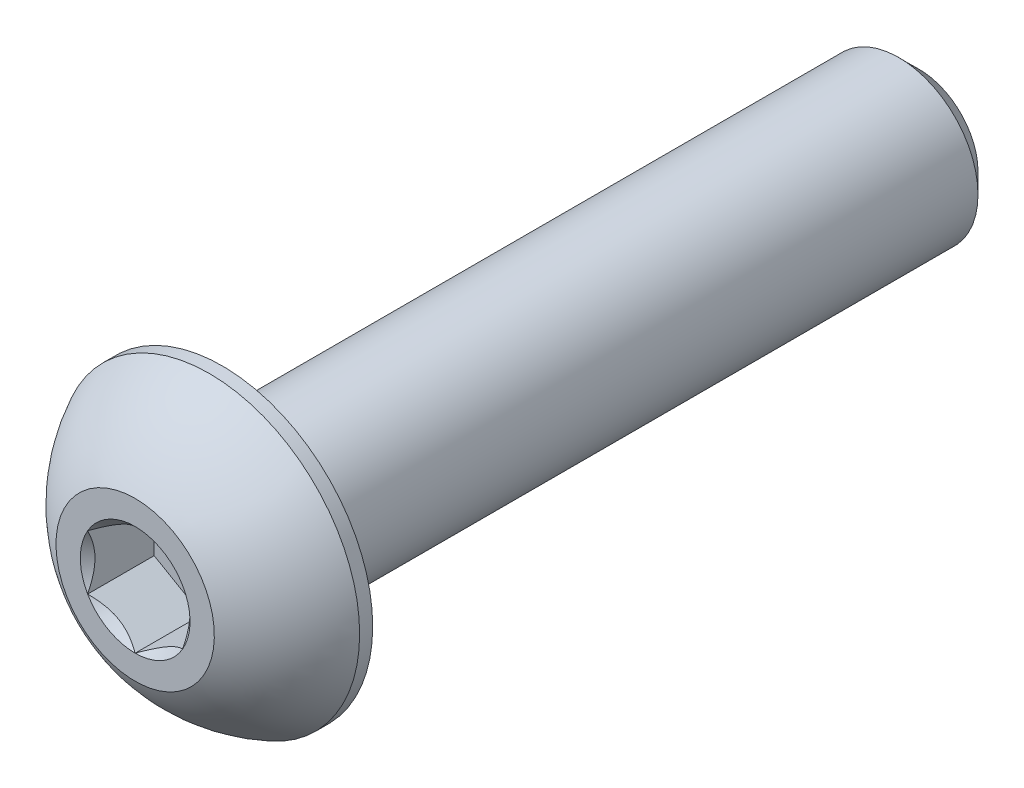
ISO-10303-21;
HEADER;
FILE_DESCRIPTION(('STEP AP214'),'2;1');
FILE_NAME('part.step','',(''),(''),'','','');
FILE_SCHEMA(('AUTOMOTIVE_DESIGN { 1 0 10303 214 1 1 1 1 }'));
ENDSEC;
DATA;
#1=APPLICATION_CONTEXT('core data for automotive mechanical design processes');
#2=APPLICATION_PROTOCOL_DEFINITION('international standard','automotive_design',2000,#1);
#3=PRODUCT_CONTEXT('',#1,'mechanical');
#4=PRODUCT('Part','Part','',(#3));
#5=PRODUCT_RELATED_PRODUCT_CATEGORY('part','',(#4));
#6=PRODUCT_DEFINITION_FORMATION('','',#4);
#7=PRODUCT_DEFINITION_CONTEXT('part definition',#1,'design');
#8=PRODUCT_DEFINITION('design','',#6,#7);
#9=PRODUCT_DEFINITION_SHAPE('','',#8);
#10=(LENGTH_UNIT() NAMED_UNIT(*) SI_UNIT(.MILLI.,.METRE.));
#11=(NAMED_UNIT(*) PLANE_ANGLE_UNIT() SI_UNIT($,.RADIAN.));
#12=(NAMED_UNIT(*) SI_UNIT($,.STERADIAN.) SOLID_ANGLE_UNIT());
#13=UNCERTAINTY_MEASURE_WITH_UNIT(LENGTH_MEASURE(1.E-05),#10,'distance_accuracy_value','');
#14=(GEOMETRIC_REPRESENTATION_CONTEXT(3) GLOBAL_UNCERTAINTY_ASSIGNED_CONTEXT((#13)) GLOBAL_UNIT_ASSIGNED_CONTEXT((#10,
#11,#12)) REPRESENTATION_CONTEXT('',''));
#15=CARTESIAN_POINT('',(0.,0.,0.));
#16=DIRECTION('',(0.,0.,1.));
#17=DIRECTION('',(1.,0.,0.));
#18=AXIS2_PLACEMENT_3D('',#15,#16,#17);
#19=CARTESIAN_POINT('',(0.,0.,12.375));
#20=DIRECTION('',(0.,0.,-1.));
#21=DIRECTION('',(-1.,0.,0.));
#22=AXIS2_PLACEMENT_3D('',#19,#20,#21);
#23=PLANE('',#22);
#24=CARTESIAN_POINT('',(0.,0.,12.375));
#25=DIRECTION('',(0.,0.,1.));
#26=DIRECTION('',(1.,0.,0.));
#27=AXIS2_PLACEMENT_3D('',#24,#25,#26);
#28=CIRCLE('',#27,1.73205080756888);
#29=CARTESIAN_POINT('',(-1.5,0.86602540378444,12.375));
#30=VERTEX_POINT('',#29);
#31=CARTESIAN_POINT('',(-1.5,-0.866025403784439,12.375));
#32=VERTEX_POINT('',#31);
#33=EDGE_CURVE('E138',#30,#32,#28,.T.);
#34=ORIENTED_EDGE('',*,*,#33,.F.);
#35=CARTESIAN_POINT('',(0.,1.73205080756888,12.375));
#36=VERTEX_POINT('',#35);
#37=EDGE_CURVE('E108',#36,#30,#28,.T.);
#38=ORIENTED_EDGE('',*,*,#37,.F.);
#39=CARTESIAN_POINT('',(1.5,0.866025403784439,12.375));
#40=VERTEX_POINT('',#39);
#41=EDGE_CURVE('E98',#40,#36,#28,.T.);
#42=ORIENTED_EDGE('',*,*,#41,.F.);
#43=CARTESIAN_POINT('',(1.5,-0.866025403784438,12.375));
#44=VERTEX_POINT('',#43);
#45=EDGE_CURVE('E59',#44,#40,#28,.T.);
#46=ORIENTED_EDGE('',*,*,#45,.F.);
#47=CARTESIAN_POINT('',(0.,-1.73205080756888,12.375));
#48=VERTEX_POINT('',#47);
#49=EDGE_CURVE('E66',#48,#44,#28,.T.);
#50=ORIENTED_EDGE('',*,*,#49,.F.);
#51=EDGE_CURVE('E141',#32,#48,#28,.T.);
#52=ORIENTED_EDGE('',*,*,#51,.F.);
#53=EDGE_LOOP('',(#34,#38,#42,#46,#50,#52));
#54=FACE_BOUND('',#53,.T.);
#55=CARTESIAN_POINT('',(0.,0.,12.375));
#56=DIRECTION('',(0.,0.,1.));
#57=DIRECTION('',(1.,0.,0.));
#58=AXIS2_PLACEMENT_3D('',#55,#56,#57);
#59=CIRCLE('',#58,2.5);
#60=CARTESIAN_POINT('',(0.,2.5,12.375));
#61=VERTEX_POINT('',#60);
#62=EDGE_CURVE('E53',#61,#61,#59,.T.);
#63=ORIENTED_EDGE('',*,*,#62,.T.);
#64=EDGE_LOOP('',(#63));
#65=FACE_BOUND('',#64,.T.);
#66=ADVANCED_FACE('F39',(#54,#65),#23,.F.);
#67=CARTESIAN_POINT('',(0.,0.,7.71694518716577));
#68=DIRECTION('',(0.,0.,1.));
#69=DIRECTION('',(0.,1.,0.));
#70=AXIS2_PLACEMENT_3D('',#67,#68,#69);
#71=SPHERICAL_SURFACE('',#70,5.28653711226622);
#72=CARTESIAN_POINT('',(0.,0.,10.0375));
#73=DIRECTION('',(0.,0.,1.));
#74=DIRECTION('',(1.,0.,0.));
#75=AXIS2_PLACEMENT_3D('',#72,#73,#74);
#76=CIRCLE('',#75,4.75);
#77=CARTESIAN_POINT('',(0.,4.75,10.0375));
#78=VERTEX_POINT('',#77);
#79=EDGE_CURVE('E239',#78,#78,#76,.T.);
#80=CARTESIAN_POINT('',(0.,2.5,12.375));
#81=CARTESIAN_POINT('',(0.,2.53026679982017,12.3587557175444));
#82=CARTESIAN_POINT('',(0.,2.56037522904968,12.3422163587936));
#83=CARTESIAN_POINT('',(0.,2.62026400427657,12.3085539481178));
#84=CARTESIAN_POINT('',(0.,2.65004435027396,12.2914308961928));
#85=CARTESIAN_POINT('',(0.,2.70926561698583,12.256607558585));
#86=CARTESIAN_POINT('',(0.,2.73870653770032,12.238907272902));
#87=CARTESIAN_POINT('',(0.,2.79723777417103,12.2029362059551));
#88=CARTESIAN_POINT('',(0.,2.82632808992726,12.184665424691));
#89=CARTESIAN_POINT('',(0.,2.88414706107589,12.1475603056073));
#90=CARTESIAN_POINT('',(0.,2.91287571646831,12.1287259677878));
#91=CARTESIAN_POINT('',(0.,2.96996045130293,12.0905008930214));
#92=CARTESIAN_POINT('',(0.,2.99831653074515,12.0711101560746));
#93=CARTESIAN_POINT('',(0.,3.05464533901891,12.0317796507551));
#94=CARTESIAN_POINT('',(0.,3.08261806785047,12.0118398823824));
#95=CARTESIAN_POINT('',(0.,3.13816954607727,11.9714188908354));
#96=CARTESIAN_POINT('',(0.,3.1657482954725,11.9509376676611));
#97=CARTESIAN_POINT('',(0.,3.22050133565615,11.909441548791));
#98=CARTESIAN_POINT('',(0.,3.24767562644455,11.8884266530951));
#99=CARTESIAN_POINT('',(0.,3.30160942393942,11.8458711742648));
#100=CARTESIAN_POINT('',(0.,3.32836893064588,11.8243305911303));
#101=CARTESIAN_POINT('',(0.,3.38146299210494,11.7807319222463));
#102=CARTESIAN_POINT('',(0.,3.40779754685753,11.7586738364968));
#103=CARTESIAN_POINT('',(0.,3.46003169800773,11.7140485438445));
#104=CARTESIAN_POINT('',(0.,3.48593129440535,11.6914813369418));
#105=CARTESIAN_POINT('',(0.,3.53728568771641,11.6458463768965));
#106=CARTESIAN_POINT('',(0.,3.56274048462986,11.6227786237539));
#107=CARTESIAN_POINT('',(0.,3.61319560685493,11.5761513363362));
#108=CARTESIAN_POINT('',(0.,3.63819593216655,11.552591802061));
#109=CARTESIAN_POINT('',(0.,3.68773261175691,11.5049899043484));
#110=CARTESIAN_POINT('',(0.,3.71226896603565,11.480947540911));
#111=CARTESIAN_POINT('',(0.,3.76086838042534,11.4323891203059));
#112=CARTESIAN_POINT('',(0.,3.78493144053629,11.4078730631382));
#113=CARTESIAN_POINT('',(0.,3.83257512329416,11.3583765704953));
#114=CARTESIAN_POINT('',(0.,3.85615574594108,11.3333961350201));
#115=CARTESIAN_POINT('',(0.,3.90282559378753,11.2829803776354));
#116=CARTESIAN_POINT('',(0.,3.92591481898706,11.257545055726));
#117=CARTESIAN_POINT('',(0.,3.97159309867276,11.2062291901907));
#118=CARTESIAN_POINT('',(0.,3.99418215315894,11.1803486465648));
#119=CARTESIAN_POINT('',(0.,4.03885150820303,11.1281521714863));
#120=CARTESIAN_POINT('',(0.,4.06093180876093,11.1018362400336));
#121=CARTESIAN_POINT('',(0.,4.10457526604591,11.0487789886263));
#122=CARTESIAN_POINT('',(0.,4.12613842277298,11.0220376686717));
#123=CARTESIAN_POINT('',(0.,4.16873939899417,10.9681398012215));
#124=CARTESIAN_POINT('',(0.,4.1897772184883,10.9409832537258));
#125=CARTESIAN_POINT('',(0.,4.23131952645464,10.886265249929));
#126=CARTESIAN_POINT('',(0.,4.25182401492686,10.8587037936279));
#127=CARTESIAN_POINT('',(0.,4.29229186971308,10.8031864448106));
#128=CARTESIAN_POINT('',(0.,4.31225523602708,10.7752305522945));
#129=CARTESIAN_POINT('',(0.,4.35163326096594,10.7189349535096));
#130=CARTESIAN_POINT('',(0.,4.3710479195908,10.6905952472408));
#131=CARTESIAN_POINT('',(0.,4.40932115213664,10.6335427892629));
#132=CARTESIAN_POINT('',(0.,4.42817972605763,10.6048300375538));
#133=CARTESIAN_POINT('',(0.,4.46533362339398,10.5470423987117));
#134=CARTESIAN_POINT('',(0.,4.48362894680934,10.5179675115786));
#135=CARTESIAN_POINT('',(0.,4.51964939166499,10.4594666496668));
#136=CARTESIAN_POINT('',(0.,4.53737451310527,10.4300406748879));
#137=CARTESIAN_POINT('',(0.,4.57224781803529,10.3708488182676));
#138=CARTESIAN_POINT('',(0.,4.58939600152503,10.3410829364262));
#139=CARTESIAN_POINT('',(0.,4.62310891815402,10.2812225776529));
#140=CARTESIAN_POINT('',(0.,4.63967365129327,10.2511281007211));
#141=CARTESIAN_POINT('',(0.,4.67221336026297,10.1906219802598));
#142=CARTESIAN_POINT('',(0.,4.68818833609342,10.1602103367303));
#143=CARTESIAN_POINT('',(0.,4.71954250823692,10.0990814631935));
#144=CARTESIAN_POINT('',(0.,4.73492170454996,10.0683642331862));
#145=CARTESIAN_POINT('',(0.,4.75,10.0375));
#146=B_SPLINE_CURVE_WITH_KNOTS('',3,(#80,#81,#82,#83,#84,#85,#86,#87,#88,#89,#90,#91,#92,#93,
#94,#95,#96,#97,#98,#99,#100,#101,#102,#103,#104,#105,#106,#107,#108,#109,#110,#111,#112,#113,
#114,#115,#116,#117,#118,#119,#120,#121,#122,#123,#124,#125,#126,#127,#128,#129,#130,#131,#132,
#133,#134,#135,#136,#137,#138,#139,#140,#141,#142,#143,#144,#145),.UNSPECIFIED.,.F.,.F.,(4,2,2,
2,2,2,2,2,2,2,2,2,2,2,2,2,2,2,2,2,2,2,2,2,2,2,2,2,2,2,2,2,4),(0.,0.103049823637829,
0.206099647275661,0.30914947091349,0.412199294551322,0.515249118189152,0.618298941826982,
0.721348765464812,0.824398589102643,0.927448412740473,1.0304982363783,1.13354806001613,
1.23659788365396,1.33964770729179,1.44269753092963,1.54574735456746,1.64879717820529,
1.75184700184312,1.85489682548095,1.95794664911878,2.06099647275661,2.16404629639444,
2.26709612003227,2.3701459436701,2.47319576730793,2.57624559094576,2.67929541458359,
2.78234523822142,2.88539506185925,2.98844488549708,3.09149470913491,3.19454453277274,
3.29759435641057),.UNSPECIFIED.);
#147=EDGE_CURVE('BSEAM246',#61,#78,#146,.T.);
#148=ORIENTED_EDGE('',*,*,#62,.F.);
#149=ORIENTED_EDGE('',*,*,#79,.T.);
#150=ORIENTED_EDGE('',*,*,#147,.T.);
#151=ORIENTED_EDGE('',*,*,#147,.F.);
#152=EDGE_LOOP('',(#148,#150,#149,#151));
#153=FACE_BOUND('',#152,.T.);
#154=ADVANCED_FACE('F246',(#153),#71,.T.);
#155=CARTESIAN_POINT('',(0.,0.,12.375));
#156=DIRECTION('',(0.,0.,1.));
#157=DIRECTION('',(1.,0.,0.));
#158=AXIS2_PLACEMENT_3D('',#155,#156,#157);
#159=CYLINDRICAL_SURFACE('',#158,4.75);
#160=ORIENTED_EDGE('',*,*,#79,.F.);
#161=EDGE_LOOP('',(#160));
#162=FACE_BOUND('',#161,.T.);
#163=CARTESIAN_POINT('',(0.,0.,9.625));
#164=DIRECTION('',(0.,0.,1.));
#165=DIRECTION('',(1.,0.,0.));
#166=AXIS2_PLACEMENT_3D('',#163,#164,#165);
#167=CIRCLE('',#166,4.75);
#168=CARTESIAN_POINT('',(4.75,0.,9.625));
#169=VERTEX_POINT('',#168);
#170=EDGE_CURVE('E235',#169,#169,#167,.T.);
#171=ORIENTED_EDGE('',*,*,#170,.T.);
#172=EDGE_LOOP('',(#171));
#173=FACE_BOUND('',#172,.T.);
#174=ADVANCED_FACE('F249',(#162,#173),#159,.T.);
#175=CARTESIAN_POINT('',(0.,2.5,9.625));
#176=DIRECTION('',(0.,0.,1.));
#177=DIRECTION('',(1.,0.,0.));
#178=AXIS2_PLACEMENT_3D('',#175,#176,#177);
#179=PLANE('',#178);
#180=ORIENTED_EDGE('',*,*,#170,.F.);
#181=EDGE_LOOP('',(#180));
#182=FACE_BOUND('',#181,.T.);
#183=CARTESIAN_POINT('',(0.,0.,9.625));
#184=DIRECTION('',(0.,0.,1.));
#185=DIRECTION('',(1.,0.,0.));
#186=AXIS2_PLACEMENT_3D('',#183,#184,#185);
#187=CIRCLE('',#186,2.49999999999999);
#188=CARTESIAN_POINT('',(2.49999999999999,0.,9.625));
#189=VERTEX_POINT('',#188);
#190=EDGE_CURVE('E231',#189,#189,#187,.T.);
#191=ORIENTED_EDGE('',*,*,#190,.T.);
#192=EDGE_LOOP('',(#191));
#193=FACE_BOUND('',#192,.T.);
#194=ADVANCED_FACE('F254',(#182,#193),#179,.F.);
#195=CARTESIAN_POINT('',(0.,0.,12.375));
#196=DIRECTION('',(0.,0.,1.));
#197=DIRECTION('',(1.,0.,0.));
#198=AXIS2_PLACEMENT_3D('',#195,#196,#197);
#199=CYLINDRICAL_SURFACE('',#198,2.49999999999999);
#200=ORIENTED_EDGE('',*,*,#190,.F.);
#201=EDGE_LOOP('',(#200));
#202=FACE_BOUND('',#201,.T.);
#203=CARTESIAN_POINT('',(0.,0.,-11.735));
#204=DIRECTION('',(0.,0.,1.));
#205=DIRECTION('',(1.,0.,0.));
#206=AXIS2_PLACEMENT_3D('',#203,#204,#205);
#207=CIRCLE('',#206,2.5);
#208=CARTESIAN_POINT('',(2.5,0.,-11.735));
#209=VERTEX_POINT('',#208);
#210=EDGE_CURVE('E227',#209,#209,#207,.T.);
#211=ORIENTED_EDGE('',*,*,#210,.T.);
#212=EDGE_LOOP('',(#211));
#213=FACE_BOUND('',#212,.T.);
#214=ADVANCED_FACE('F260',(#202,#213),#199,.T.);
#215=CARTESIAN_POINT('',(0.,0.,-12.375));
#216=DIRECTION('',(0.,0.,1.));
#217=DIRECTION('',(1.,0.,0.));
#218=AXIS2_PLACEMENT_3D('',#215,#216,#217);
#219=CONICAL_SURFACE('',#218,1.86,0.785398163397444);
#220=ORIENTED_EDGE('',*,*,#210,.F.);
#221=EDGE_LOOP('',(#220));
#222=FACE_BOUND('',#221,.T.);
#223=CARTESIAN_POINT('',(0.,0.,-12.375));
#224=DIRECTION('',(0.,0.,1.));
#225=DIRECTION('',(1.,0.,0.));
#226=AXIS2_PLACEMENT_3D('',#223,#224,#225);
#227=CIRCLE('',#226,1.86);
#228=CARTESIAN_POINT('',(1.86,0.,-12.375));
#229=VERTEX_POINT('',#228);
#230=EDGE_CURVE('E209',#229,#229,#227,.T.);
#231=ORIENTED_EDGE('',*,*,#230,.T.);
#232=EDGE_LOOP('',(#231));
#233=FACE_BOUND('',#232,.T.);
#234=ADVANCED_FACE('F266',(#222,#233),#219,.T.);
#235=CARTESIAN_POINT('',(0.,0.,-12.375));
#236=DIRECTION('',(0.,0.,1.));
#237=DIRECTION('',(1.,0.,0.));
#238=AXIS2_PLACEMENT_3D('',#235,#236,#237);
#239=PLANE('',#238);
#240=ORIENTED_EDGE('',*,*,#230,.F.);
#241=EDGE_LOOP('',(#240));
#242=FACE_BOUND('',#241,.T.);
#243=ADVANCED_FACE('F175',(#242),#239,.F.);
#244=CARTESIAN_POINT('',(0.,0.,12.375));
#245=DIRECTION('',(0.,0.,1.));
#246=DIRECTION('',(1.,0.,0.));
#247=AXIS2_PLACEMENT_3D('',#244,#245,#246);
#248=CONICAL_SURFACE('',#247,1.73205080756888,0.78539816339745);
#249=ORIENTED_EDGE('',*,*,#37,.T.);
#250=CARTESIAN_POINT('',(0.000200000000000348,1.73216627762272,12.3751154816001));
#251=CARTESIAN_POINT('',(-0.0513677907370757,1.70239359975915,12.3453654760673));
#252=CARTESIAN_POINT('',(-0.103797917665201,1.67212305186355,12.3173624839103));
#253=CARTESIAN_POINT('',(-0.210709034055597,1.61039789003619,12.2660892304401));
#254=CARTESIAN_POINT('',(-0.265200195814661,1.57893740312614,12.2428475050444));
#255=CARTESIAN_POINT('',(-0.375079081357248,1.51549879897987,12.2030337289922));
#256=CARTESIAN_POINT('',(-0.4304388090952,1.4835368452681,12.1863615856709));
#257=CARTESIAN_POINT('',(-0.542377257477151,1.41890915196211,12.1606744568181));
#258=CARTESIAN_POINT('',(-0.598952556553008,1.38624538781118,12.1516402904789));
#259=CARTESIAN_POINT('',(-0.696455389516441,1.329952100953,12.1434890812269));
#260=CARTESIAN_POINT('',(-0.737256908280466,1.30639533311124,12.1422822529892));
#261=CARTESIAN_POINT('',(-0.818787969615858,1.25932335290194,12.1443140571623));
#262=CARTESIAN_POINT('',(-0.85951749431463,1.23580815085313,12.1475536707483));
#263=CARTESIAN_POINT('',(-0.940584402163416,1.18900414978427,12.158291985982));
#264=CARTESIAN_POINT('',(-0.980921384598288,1.1657155821172,12.1657946530187));
#265=CARTESIAN_POINT('',(-1.06091833691403,1.11952932016335,12.1846516119283));
#266=CARTESIAN_POINT('',(-1.10057800851621,1.09663179808786,12.1960075570186));
#267=CARTESIAN_POINT('',(-1.20216313477449,1.03798159809698,12.2297216475927));
#268=CARTESIAN_POINT('',(-1.26345855370969,1.00259267147465,12.2546218490934));
#269=CARTESIAN_POINT('',(-1.35358562846331,0.950557780604375,12.2966566532716));
#270=CARTESIAN_POINT('',(-1.38328513990772,0.933410759677148,12.3114251535591));
#271=CARTESIAN_POINT('',(-1.44213790138375,0.899432101996407,12.3423105659402));
#272=CARTESIAN_POINT('',(-1.47129140422064,0.882600319285711,12.3584268341217));
#273=CARTESIAN_POINT('',(-1.5002,0.865909933730602,12.3751154816001));
#274=B_SPLINE_CURVE_WITH_KNOTS('',3,(#250,#251,#252,#253,#254,#255,#256,#257,#258,#259,#260,
#261,#262,#263,#264,#265,#266,#267,#268,#269,#270,#271,#272,#273),.UNSPECIFIED.,.F.,.F.,(4,2,2,
2,2,2,2,2,2,2,2,4),(0.,0.199829143693305,0.400822987382389,0.598623720538181,0.795926240188889,
0.937113067959881,1.07833105577193,1.21968061668222,1.36109089931054,1.58570969637566,
1.69770705470964,1.80965120737194),.UNSPECIFIED.);
#275=EDGE_CURVE('E11',#36,#30,#274,.T.);
#276=ORIENTED_EDGE('',*,*,#275,.F.);
#277=EDGE_LOOP('',(#249,#276));
#278=FACE_BOUND('',#277,.T.);
#279=ADVANCED_FACE('F112',(#278),#248,.F.);
#280=ORIENTED_EDGE('',*,*,#33,.T.);
#281=CARTESIAN_POINT('',(-1.5,-1.72720812969692,12.9305785162708));
#282=CARTESIAN_POINT('',(-1.5,-1.68515175699268,12.8988299078574));
#283=CARTESIAN_POINT('',(-1.5,-1.64286104748673,12.8673925938074));
#284=CARTESIAN_POINT('',(-1.5,-1.55771581035942,12.8052690875564));
#285=CARTESIAN_POINT('',(-1.5,-1.51486114386668,12.7745830858922));
#286=CARTESIAN_POINT('',(-1.5,-1.3846813415127,12.6834071924272));
#287=CARTESIAN_POINT('',(-1.5,-1.29637976071653,12.6242883434268));
#288=CARTESIAN_POINT('',(-1.5,-1.11121478730467,12.5082309963165));
#289=CARTESIAN_POINT('',(-1.5,-1.01415038238167,12.451609558733));
#290=CARTESIAN_POINT('',(-1.5,-0.815173408897605,12.3480368812657));
#291=CARTESIAN_POINT('',(-1.5,-0.713278669253284,12.3010530415417));
#292=CARTESIAN_POINT('',(-1.5,-0.560333774943111,12.2435726684308));
#293=CARTESIAN_POINT('',(-1.5,-0.511547982948041,12.2270753877572));
#294=CARTESIAN_POINT('',(-1.5,-0.412798620136866,12.197997512927));
#295=CARTESIAN_POINT('',(-1.5,-0.362834968437562,12.185417188594));
#296=CARTESIAN_POINT('',(-1.5,-0.262863235444982,12.1650361941468));
#297=CARTESIAN_POINT('',(-1.5,-0.212872113808022,12.157153632746));
#298=CARTESIAN_POINT('',(-1.5,-0.112355243569545,12.146322063969));
#299=CARTESIAN_POINT('',(-1.5,-0.061829588372628,12.1433722085244));
#300=CARTESIAN_POINT('',(-1.5,0.0374291733323841,12.1426248577248));
#301=CARTESIAN_POINT('',(-1.5,0.0861609672002992,12.1446447335581));
#302=CARTESIAN_POINT('',(-1.5,0.183206937768827,12.1533225528968));
#303=CARTESIAN_POINT('',(-1.5,0.231521073438269,12.1599809469685));
#304=CARTESIAN_POINT('',(-1.5,0.328199853425436,12.1776852441226));
#305=CARTESIAN_POINT('',(-1.5,0.376550616310328,12.188805811257));
#306=CARTESIAN_POINT('',(-1.5,0.472195697125598,12.2148434140487));
#307=CARTESIAN_POINT('',(-1.5,0.519490103092741,12.2297601320409));
#308=CARTESIAN_POINT('',(-1.5,0.668391282696625,12.2823352235961));
#309=CARTESIAN_POINT('',(-1.5,0.767878709508553,12.325981287472));
#310=CARTESIAN_POINT('',(-1.5,0.962179866690724,12.4230229945931));
#311=CARTESIAN_POINT('',(-1.5,1.05697519961444,12.4764536650895));
#312=CARTESIAN_POINT('',(-1.5,1.23814273533383,12.5866858520046));
#313=CARTESIAN_POINT('',(-1.5,1.3246994218129,12.6431879206986));
#314=CARTESIAN_POINT('',(-1.5,1.45222331290673,12.7305343015787));
#315=CARTESIAN_POINT('',(-1.5,1.49418091978756,12.75995775868));
#316=CARTESIAN_POINT('',(-1.5,1.57752272931476,12.8195828218305));
#317=CARTESIAN_POINT('',(-1.5,1.61890708647354,12.8497842116644));
#318=CARTESIAN_POINT('',(-1.5,1.66005278019494,12.8803081786095));
#319=B_SPLINE_CURVE_WITH_KNOTS('',3,(#281,#282,#283,#284,#285,#286,#287,#288,#289,#290,#291,
#292,#293,#294,#295,#296,#297,#298,#299,#300,#301,#302,#303,#304,#305,#306,#307,#308,#309,#310,
#311,#312,#313,#314,#315,#316,#317,#318),.UNSPECIFIED.,.F.,.F.,(4,2,2,2,2,2,2,2,2,2,2,2,2,2,2,2,
2,2,4),(0.,0.158079548982669,0.316198780993942,0.63485041734696,0.971690311361511,
1.30737131660667,1.46173961127089,1.61611853740677,1.76772101421409,1.91929742368538,
2.065387412096,2.21149159305544,2.36014984633872,2.50879566386709,2.83376031422673,
3.15991186985652,3.46985601802197,3.62358896039974,3.7772796264207),.UNSPECIFIED.);
#320=EDGE_CURVE('E107',#30,#32,#319,.F.);
#321=ORIENTED_EDGE('',*,*,#320,.F.);
#322=EDGE_LOOP('',(#280,#321));
#323=FACE_BOUND('',#322,.T.);
#324=ADVANCED_FACE('F278',(#323),#248,.F.);
#325=ORIENTED_EDGE('',*,*,#51,.T.);
#326=CARTESIAN_POINT('',(-1.5002,-0.8659099337306,12.3751154816001));
#327=CARTESIAN_POINT('',(-1.44863220926292,-0.895682611594165,12.3453654760673));
#328=CARTESIAN_POINT('',(-1.3962020823348,-0.925953159489765,12.3173624839103));
#329=CARTESIAN_POINT('',(-1.2892909659444,-0.987678321317123,12.2660892304401));
#330=CARTESIAN_POINT('',(-1.23479980418534,-1.01913880822717,12.2428475050444));
#331=CARTESIAN_POINT('',(-1.12492091864275,-1.08257741237344,12.2030337289922));
#332=CARTESIAN_POINT('',(-1.0695611909048,-1.11453936608521,12.1863615856709));
#333=CARTESIAN_POINT('',(-0.957622742522849,-1.1791670593912,12.1606744568181));
#334=CARTESIAN_POINT('',(-0.901047443446992,-1.21183082354213,12.1516402904789));
#335=CARTESIAN_POINT('',(-0.803544610483559,-1.26812411040032,12.1434890812268));
#336=CARTESIAN_POINT('',(-0.762743091719534,-1.29168087824208,12.1422822529892));
#337=CARTESIAN_POINT('',(-0.681212030384142,-1.33875285845138,12.1443140571623));
#338=CARTESIAN_POINT('',(-0.64048250568537,-1.36226806050018,12.1475536707483));
#339=CARTESIAN_POINT('',(-0.559415597836584,-1.40907206156905,12.158291985982));
#340=CARTESIAN_POINT('',(-0.519078615401712,-1.43236062923612,12.1657946530187));
#341=CARTESIAN_POINT('',(-0.439081663085969,-1.47854689118996,12.1846516119283));
#342=CARTESIAN_POINT('',(-0.399421991483792,-1.50144441326545,12.1960075570186));
#343=CARTESIAN_POINT('',(-0.297836865225515,-1.56009461325633,12.2297216475927));
#344=CARTESIAN_POINT('',(-0.236541446290311,-1.59548353987866,12.2546218490934));
#345=CARTESIAN_POINT('',(-0.146414371536687,-1.64751843074894,12.2966566532716));
#346=CARTESIAN_POINT('',(-0.116714860092283,-1.66466545167617,12.3114251535591));
#347=CARTESIAN_POINT('',(-0.0578620986162495,-1.69864410935691,12.3423105659402));
#348=CARTESIAN_POINT('',(-0.0287085957793633,-1.71547589206761,12.3584268341217));
#349=CARTESIAN_POINT('',(0.000199999999999423,-1.73216627762271,12.3751154816001));
#350=B_SPLINE_CURVE_WITH_KNOTS('',3,(#326,#327,#328,#329,#330,#331,#332,#333,#334,#335,#336,
#337,#338,#339,#340,#341,#342,#343,#344,#345,#346,#347,#348,#349),.UNSPECIFIED.,.F.,.F.,(4,2,2,
2,2,2,2,2,2,2,2,4),(0.,0.199829143693305,0.400822987382389,0.59862372053818,0.795926240188889,
0.937113067959881,1.07833105577193,1.21968061668222,1.36109089931054,1.58570969637565,
1.69770705470964,1.80965120737194),.UNSPECIFIED.);
#351=EDGE_CURVE('E151',#32,#48,#350,.T.);
#352=ORIENTED_EDGE('',*,*,#351,.F.);
#353=EDGE_LOOP('',(#325,#352));
#354=FACE_BOUND('',#353,.T.);
#355=ADVANCED_FACE('F386',(#354),#248,.F.);
#356=ORIENTED_EDGE('',*,*,#49,.T.);
#357=CARTESIAN_POINT('',(-0.000200000000000595,-1.73216627762271,12.3751154816001));
#358=CARTESIAN_POINT('',(0.0513677907370751,-1.70239359975915,12.3453654760673));
#359=CARTESIAN_POINT('',(0.1037979176652,-1.67212305186355,12.3173624839103));
#360=CARTESIAN_POINT('',(0.210709034055596,-1.61039789003619,12.2660892304401));
#361=CARTESIAN_POINT('',(0.26520019581466,-1.57893740312614,12.2428475050444));
#362=CARTESIAN_POINT('',(0.375079081357248,-1.51549879897987,12.2030337289922));
#363=CARTESIAN_POINT('',(0.430438809095199,-1.4835368452681,12.1863615856709));
#364=CARTESIAN_POINT('',(0.54237725747715,-1.41890915196211,12.1606744568181));
#365=CARTESIAN_POINT('',(0.598952556553008,-1.38624538781118,12.1516402904789));
#366=CARTESIAN_POINT('',(0.69645538951644,-1.32995210095299,12.1434890812268));
#367=CARTESIAN_POINT('',(0.737256908280465,-1.30639533311124,12.1422822529892));
#368=CARTESIAN_POINT('',(0.818787969615857,-1.25932335290193,12.1443140571623));
#369=CARTESIAN_POINT('',(0.859517494314629,-1.23580815085313,12.1475536707483));
#370=CARTESIAN_POINT('',(0.940584402163415,-1.18900414978427,12.158291985982));
#371=CARTESIAN_POINT('',(0.980921384598287,-1.1657155821172,12.1657946530187));
#372=CARTESIAN_POINT('',(1.06091833691403,-1.11952932016335,12.1846516119283));
#373=CARTESIAN_POINT('',(1.10057800851621,-1.09663179808786,12.1960075570186));
#374=CARTESIAN_POINT('',(1.20216313477448,-1.03798159809698,12.2297216475927));
#375=CARTESIAN_POINT('',(1.26345855370969,-1.00259267147465,12.2546218490934));
#376=CARTESIAN_POINT('',(1.35358562846331,-0.950557780604374,12.2966566532716));
#377=CARTESIAN_POINT('',(1.38328513990772,-0.933410759677147,12.3114251535591));
#378=CARTESIAN_POINT('',(1.44213790138375,-0.899432101996407,12.3423105659402));
#379=CARTESIAN_POINT('',(1.47129140422064,-0.88260031928571,12.3584268341217));
#380=CARTESIAN_POINT('',(1.5002,-0.865909933730601,12.3751154816001));
#381=B_SPLINE_CURVE_WITH_KNOTS('',3,(#357,#358,#359,#360,#361,#362,#363,#364,#365,#366,#367,
#368,#369,#370,#371,#372,#373,#374,#375,#376,#377,#378,#379,#380),.UNSPECIFIED.,.F.,.F.,(4,2,2,
2,2,2,2,2,2,2,2,4),(0.,0.199829143693305,0.400822987382388,0.59862372053818,0.795926240188889,
0.93711306795988,1.07833105577193,1.21968061668222,1.36109089931054,1.58570969637565,
1.69770705470964,1.80965120737194),.UNSPECIFIED.);
#382=EDGE_CURVE('E369',#48,#44,#381,.T.);
#383=ORIENTED_EDGE('',*,*,#382,.F.);
#384=EDGE_LOOP('',(#356,#383));
#385=FACE_BOUND('',#384,.T.);
#386=ADVANCED_FACE('F387',(#385),#248,.F.);
#387=ORIENTED_EDGE('',*,*,#45,.T.);
#388=CARTESIAN_POINT('',(1.5,-1.72720812969692,12.9305785162708));
#389=CARTESIAN_POINT('',(1.5,-1.68515175699268,12.8988299078574));
#390=CARTESIAN_POINT('',(1.5,-1.64286104748674,12.8673925938074));
#391=CARTESIAN_POINT('',(1.5,-1.55771581035942,12.8052690875564));
#392=CARTESIAN_POINT('',(1.5,-1.51486114386668,12.7745830858922));
#393=CARTESIAN_POINT('',(1.5,-1.3846813415127,12.6834071924272));
#394=CARTESIAN_POINT('',(1.5,-1.29637976071654,12.6242883434268));
#395=CARTESIAN_POINT('',(1.5,-1.11121478730467,12.5082309963165));
#396=CARTESIAN_POINT('',(1.5,-1.01415038238167,12.451609558733));
#397=CARTESIAN_POINT('',(1.5,-0.815173408897605,12.3480368812657));
#398=CARTESIAN_POINT('',(1.5,-0.713278669253285,12.3010530415417));
#399=CARTESIAN_POINT('',(1.5,-0.560333774943111,12.2435726684308));
#400=CARTESIAN_POINT('',(1.5,-0.511547982948042,12.2270753877572));
#401=CARTESIAN_POINT('',(1.5,-0.412798620136867,12.197997512927));
#402=CARTESIAN_POINT('',(1.5,-0.362834968437563,12.185417188594));
#403=CARTESIAN_POINT('',(1.5,-0.262863235444982,12.1650361941468));
#404=CARTESIAN_POINT('',(1.5,-0.212872113808023,12.157153632746));
#405=CARTESIAN_POINT('',(1.5,-0.112355243569546,12.146322063969));
#406=CARTESIAN_POINT('',(1.5,-0.0618295883726284,12.1433722085244));
#407=CARTESIAN_POINT('',(1.5,0.0374291733323835,12.1426248577248));
#408=CARTESIAN_POINT('',(1.5,0.0861609672002985,12.1446447335581));
#409=CARTESIAN_POINT('',(1.5,0.183206937768827,12.1533225528968));
#410=CARTESIAN_POINT('',(1.5,0.231521073438269,12.1599809469685));
#411=CARTESIAN_POINT('',(1.5,0.328199853425435,12.1776852441226));
#412=CARTESIAN_POINT('',(1.5,0.376550616310328,12.188805811257));
#413=CARTESIAN_POINT('',(1.5,0.472195697125598,12.2148434140487));
#414=CARTESIAN_POINT('',(1.5,0.51949010309274,12.2297601320409));
#415=CARTESIAN_POINT('',(1.5,0.668391282696624,12.2823352235961));
#416=CARTESIAN_POINT('',(1.5,0.767878709508552,12.325981287472));
#417=CARTESIAN_POINT('',(1.5,0.962179866690724,12.4230229945931));
#418=CARTESIAN_POINT('',(1.5,1.05697519961444,12.4764536650895));
#419=CARTESIAN_POINT('',(1.5,1.23814273533383,12.5866858520046));
#420=CARTESIAN_POINT('',(1.5,1.3246994218129,12.6431879206986));
#421=CARTESIAN_POINT('',(1.5,1.45222331290673,12.7305343015787));
#422=CARTESIAN_POINT('',(1.5,1.49418091978756,12.75995775868));
#423=CARTESIAN_POINT('',(1.5,1.57752272931476,12.8195828218305));
#424=CARTESIAN_POINT('',(1.5,1.61890708647354,12.8497842116644));
#425=CARTESIAN_POINT('',(1.5,1.66005278019494,12.8803081786095));
#426=B_SPLINE_CURVE_WITH_KNOTS('',3,(#388,#389,#390,#391,#392,#393,#394,#395,#396,#397,#398,
#399,#400,#401,#402,#403,#404,#405,#406,#407,#408,#409,#410,#411,#412,#413,#414,#415,#416,#417,
#418,#419,#420,#421,#422,#423,#424,#425),.UNSPECIFIED.,.F.,.F.,(4,2,2,2,2,2,2,2,2,2,2,2,2,2,2,2,
2,2,4),(0.,0.158079548982669,0.316198780993942,0.634850417346959,0.971690311361511,
1.30737131660667,1.46173961127089,1.61611853740677,1.76772101421409,1.91929742368538,
2.065387412096,2.21149159305544,2.36014984633872,2.50879566386709,2.83376031422673,
3.15991186985652,3.46985601802197,3.62358896039974,3.77727962642071),.UNSPECIFIED.);
#427=EDGE_CURVE('E125',#44,#40,#426,.T.);
#428=ORIENTED_EDGE('',*,*,#427,.F.);
#429=EDGE_LOOP('',(#387,#428));
#430=FACE_BOUND('',#429,.T.);
#431=ADVANCED_FACE('F389',(#430),#248,.F.);
#432=ORIENTED_EDGE('',*,*,#41,.T.);
#433=CARTESIAN_POINT('',(1.5002,0.865909933730602,12.3751154816001));
#434=CARTESIAN_POINT('',(1.44863220926292,0.895682611594167,12.3453654760673));
#435=CARTESIAN_POINT('',(1.3962020823348,0.925953159489766,12.3173624839103));
#436=CARTESIAN_POINT('',(1.2892909659444,0.987678321317124,12.2660892304401));
#437=CARTESIAN_POINT('',(1.23479980418534,1.01913880822718,12.2428475050444));
#438=CARTESIAN_POINT('',(1.12492091864275,1.08257741237344,12.2030337289922));
#439=CARTESIAN_POINT('',(1.0695611909048,1.11453936608521,12.1863615856709));
#440=CARTESIAN_POINT('',(0.957622742522849,1.1791670593912,12.1606744568181));
#441=CARTESIAN_POINT('',(0.901047443446991,1.21183082354213,12.1516402904789));
#442=CARTESIAN_POINT('',(0.803544610483559,1.26812411040032,12.1434890812269));
#443=CARTESIAN_POINT('',(0.762743091719533,1.29168087824208,12.1422822529892));
#444=CARTESIAN_POINT('',(0.681212030384141,1.33875285845138,12.1443140571623));
#445=CARTESIAN_POINT('',(0.64048250568537,1.36226806050018,12.1475536707483));
#446=CARTESIAN_POINT('',(0.559415597836583,1.40907206156905,12.158291985982));
#447=CARTESIAN_POINT('',(0.519078615401711,1.43236062923612,12.1657946530187));
#448=CARTESIAN_POINT('',(0.439081663085969,1.47854689118997,12.1846516119283));
#449=CARTESIAN_POINT('',(0.399421991483792,1.50144441326545,12.1960075570186));
#450=CARTESIAN_POINT('',(0.297836865225515,1.56009461325633,12.2297216475927));
#451=CARTESIAN_POINT('',(0.23654144629031,1.59548353987866,12.2546218490934));
#452=CARTESIAN_POINT('',(0.146414371536686,1.64751843074894,12.2966566532716));
#453=CARTESIAN_POINT('',(0.116714860092282,1.66466545167617,12.3114251535591));
#454=CARTESIAN_POINT('',(0.0578620986162489,1.69864410935691,12.3423105659402));
#455=CARTESIAN_POINT('',(0.0287085957793628,1.71547589206761,12.3584268341217));
#456=CARTESIAN_POINT('',(-0.000199999999999864,1.73216627762272,12.3751154816001));
#457=B_SPLINE_CURVE_WITH_KNOTS('',3,(#433,#434,#435,#436,#437,#438,#439,#440,#441,#442,#443,
#444,#445,#446,#447,#448,#449,#450,#451,#452,#453,#454,#455,#456),.UNSPECIFIED.,.F.,.F.,(4,2,2,
2,2,2,2,2,2,2,2,4),(0.,0.199829143693305,0.400822987382389,0.598623720538181,0.79592624018889,
0.937113067959882,1.07833105577193,1.21968061668222,1.36109089931055,1.58570969637566,
1.69770705470964,1.80965120737194),.UNSPECIFIED.);
#458=EDGE_CURVE('E102',#40,#36,#457,.T.);
#459=ORIENTED_EDGE('',*,*,#458,.F.);
#460=EDGE_LOOP('',(#432,#459));
#461=FACE_BOUND('',#460,.T.);
#462=ADVANCED_FACE('F100',(#461),#248,.F.);
#463=CARTESIAN_POINT('',(0.,0.,10.275));
#464=DIRECTION('',(0.,0.,1.));
#465=DIRECTION('',(1.,0.,0.));
#466=AXIS2_PLACEMENT_3D('',#463,#464,#465);
#467=PLANE('',#466);
#468=DIRECTION('',(-0.866025403784439,0.5,0.));
#469=VECTOR('',#468,1.);
#470=CARTESIAN_POINT('',(1.5,0.86602540378444,10.275));
#471=LINE('',#470,#469);
#472=CARTESIAN_POINT('',(1.5,0.86602540378444,10.275));
#473=VERTEX_POINT('',#472);
#474=CARTESIAN_POINT('',(0.,1.73205080756888,10.275));
#475=VERTEX_POINT('',#474);
#476=EDGE_CURVE('E124',#473,#475,#471,.T.);
#477=ORIENTED_EDGE('',*,*,#476,.T.);
#478=DIRECTION('',(-0.866025403784439,-0.5,0.));
#479=VECTOR('',#478,1.);
#480=CARTESIAN_POINT('',(0.,1.73205080756888,10.275));
#481=LINE('',#480,#479);
#482=CARTESIAN_POINT('',(-1.5,0.86602540378444,10.275));
#483=VERTEX_POINT('',#482);
#484=EDGE_CURVE('E129',#475,#483,#481,.T.);
#485=ORIENTED_EDGE('',*,*,#484,.T.);
#486=DIRECTION('',(0.,-1.,0.));
#487=VECTOR('',#486,1.);
#488=CARTESIAN_POINT('',(-1.5,0.86602540378444,10.275));
#489=LINE('',#488,#487);
#490=CARTESIAN_POINT('',(-1.5,-0.866025403784438,10.275));
#491=VERTEX_POINT('',#490);
#492=EDGE_CURVE('E192',#483,#491,#489,.T.);
#493=ORIENTED_EDGE('',*,*,#492,.T.);
#494=DIRECTION('',(0.866025403784438,-0.5,0.));
#495=VECTOR('',#494,1.);
#496=CARTESIAN_POINT('',(-1.5,-0.866025403784438,10.275));
#497=LINE('',#496,#495);
#498=CARTESIAN_POINT('',(0.,-1.73205080756888,10.275));
#499=VERTEX_POINT('',#498);
#500=EDGE_CURVE('E196',#491,#499,#497,.T.);
#501=ORIENTED_EDGE('',*,*,#500,.T.);
#502=DIRECTION('',(0.866025403784439,0.5,0.));
#503=VECTOR('',#502,1.);
#504=CARTESIAN_POINT('',(0.,-1.73205080756888,10.275));
#505=LINE('',#504,#503);
#506=CARTESIAN_POINT('',(1.5,-0.866025403784438,10.275));
#507=VERTEX_POINT('',#506);
#508=EDGE_CURVE('E200',#499,#507,#505,.T.);
#509=ORIENTED_EDGE('',*,*,#508,.T.);
#510=DIRECTION('',(0.,1.,0.));
#511=VECTOR('',#510,1.);
#512=CARTESIAN_POINT('',(1.5,-0.866025403784438,10.275));
#513=LINE('',#512,#511);
#514=EDGE_CURVE('E133',#507,#473,#513,.T.);
#515=ORIENTED_EDGE('',*,*,#514,.T.);
#516=EDGE_LOOP('',(#477,#485,#493,#501,#509,#515));
#517=FACE_BOUND('',#516,.T.);
#518=ADVANCED_FACE('F170',(#517),#467,.T.);
#519=CARTESIAN_POINT('',(0.,1.73205080756888,10.275));
#520=DIRECTION('',(-0.5,0.866025403784439,0.));
#521=DIRECTION('',(-0.866025403784439,-0.5,0.));
#522=AXIS2_PLACEMENT_3D('',#519,#520,#521);
#523=PLANE('',#522);
#524=DIRECTION('',(0.,0.,1.));
#525=VECTOR('',#524,1.);
#526=CARTESIAN_POINT('',(0.,1.73205080756888,10.275));
#527=LINE('',#526,#525);
#528=EDGE_CURVE('E120',#475,#36,#527,.T.);
#529=ORIENTED_EDGE('',*,*,#528,.T.);
#530=ORIENTED_EDGE('',*,*,#275,.T.);
#531=DIRECTION('',(0.,0.,1.));
#532=VECTOR('',#531,1.);
#533=CARTESIAN_POINT('',(-1.5,0.86602540378444,10.275));
#534=LINE('',#533,#532);
#535=EDGE_CURVE('E132',#483,#30,#534,.T.);
#536=ORIENTED_EDGE('',*,*,#535,.F.);
#537=ORIENTED_EDGE('',*,*,#484,.F.);
#538=EDGE_LOOP('',(#529,#530,#536,#537));
#539=FACE_BOUND('',#538,.T.);
#540=ADVANCED_FACE('F127',(#539),#523,.F.);
#541=CARTESIAN_POINT('',(-1.5,0.86602540378444,10.275));
#542=DIRECTION('',(-1.,0.,0.));
#543=DIRECTION('',(0.,0.,1.));
#544=AXIS2_PLACEMENT_3D('',#541,#542,#543);
#545=PLANE('',#544);
#546=ORIENTED_EDGE('',*,*,#535,.T.);
#547=ORIENTED_EDGE('',*,*,#320,.T.);
#548=DIRECTION('',(0.,0.,1.));
#549=VECTOR('',#548,1.);
#550=CARTESIAN_POINT('',(-1.5,-0.866025403784438,10.275));
#551=LINE('',#550,#549);
#552=EDGE_CURVE('E218',#491,#32,#551,.T.);
#553=ORIENTED_EDGE('',*,*,#552,.F.);
#554=ORIENTED_EDGE('',*,*,#492,.F.);
#555=EDGE_LOOP('',(#546,#547,#553,#554));
#556=FACE_BOUND('',#555,.T.);
#557=ADVANCED_FACE('F160',(#556),#545,.F.);
#558=CARTESIAN_POINT('',(-1.5,-0.866025403784438,10.275));
#559=DIRECTION('',(-0.5,-0.866025403784438,0.));
#560=DIRECTION('',(0.866025403784439,-0.5,0.));
#561=AXIS2_PLACEMENT_3D('',#558,#559,#560);
#562=PLANE('',#561);
#563=ORIENTED_EDGE('',*,*,#552,.T.);
#564=ORIENTED_EDGE('',*,*,#351,.T.);
#565=DIRECTION('',(0.,0.,1.));
#566=VECTOR('',#565,1.);
#567=CARTESIAN_POINT('',(0.,-1.73205080756888,10.275));
#568=LINE('',#567,#566);
#569=EDGE_CURVE('E214',#499,#48,#568,.T.);
#570=ORIENTED_EDGE('',*,*,#569,.F.);
#571=ORIENTED_EDGE('',*,*,#500,.F.);
#572=EDGE_LOOP('',(#563,#564,#570,#571));
#573=FACE_BOUND('',#572,.T.);
#574=ADVANCED_FACE('F163',(#573),#562,.F.);
#575=CARTESIAN_POINT('',(0.,-1.73205080756888,10.275));
#576=DIRECTION('',(0.5,-0.866025403784439,0.));
#577=DIRECTION('',(0.866025403784439,0.5,0.));
#578=AXIS2_PLACEMENT_3D('',#575,#576,#577);
#579=PLANE('',#578);
#580=ORIENTED_EDGE('',*,*,#569,.T.);
#581=ORIENTED_EDGE('',*,*,#382,.T.);
#582=DIRECTION('',(0.,0.,1.));
#583=VECTOR('',#582,1.);
#584=CARTESIAN_POINT('',(1.5,-0.866025403784438,10.275));
#585=LINE('',#584,#583);
#586=EDGE_CURVE('E210',#507,#44,#585,.T.);
#587=ORIENTED_EDGE('',*,*,#586,.F.);
#588=ORIENTED_EDGE('',*,*,#508,.F.);
#589=EDGE_LOOP('',(#580,#581,#587,#588));
#590=FACE_BOUND('',#589,.T.);
#591=ADVANCED_FACE('F337',(#590),#579,.F.);
#592=CARTESIAN_POINT('',(1.5,-0.866025403784438,10.275));
#593=DIRECTION('',(1.,0.,0.));
#594=DIRECTION('',(0.,1.,0.));
#595=AXIS2_PLACEMENT_3D('',#592,#593,#594);
#596=PLANE('',#595);
#597=ORIENTED_EDGE('',*,*,#586,.T.);
#598=ORIENTED_EDGE('',*,*,#427,.T.);
#599=DIRECTION('',(0.,0.,1.));
#600=VECTOR('',#599,1.);
#601=CARTESIAN_POINT('',(1.5,0.86602540378444,10.275));
#602=LINE('',#601,#600);
#603=EDGE_CURVE('E122',#473,#40,#602,.T.);
#604=ORIENTED_EDGE('',*,*,#603,.F.);
#605=ORIENTED_EDGE('',*,*,#514,.F.);
#606=EDGE_LOOP('',(#597,#598,#604,#605));
#607=FACE_BOUND('',#606,.T.);
#608=ADVANCED_FACE('F174',(#607),#596,.F.);
#609=CARTESIAN_POINT('',(1.5,0.86602540378444,10.275));
#610=DIRECTION('',(0.5,0.866025403784439,0.));
#611=DIRECTION('',(-0.866025403784439,0.5,0.));
#612=AXIS2_PLACEMENT_3D('',#609,#610,#611);
#613=PLANE('',#612);
#614=ORIENTED_EDGE('',*,*,#603,.T.);
#615=ORIENTED_EDGE('',*,*,#458,.T.);
#616=ORIENTED_EDGE('',*,*,#528,.F.);
#617=ORIENTED_EDGE('',*,*,#476,.F.);
#618=EDGE_LOOP('',(#614,#615,#616,#617));
#619=FACE_BOUND('',#618,.T.);
#620=ADVANCED_FACE('F118',(#619),#613,.F.);
#621=CLOSED_SHELL('',(#66,#154,#174,#194,#214,#234,#243,#279,#324,#355,#386,#431,#462,#518,#540,
#557,#574,#591,#608,#620));
#622=MANIFOLD_SOLID_BREP('B2',#621);
#623=ADVANCED_BREP_SHAPE_REPRESENTATION('',(#18,#622),#14);
#624=SHAPE_DEFINITION_REPRESENTATION(#9,#623);
ENDSEC;
END-ISO-10303-21;
